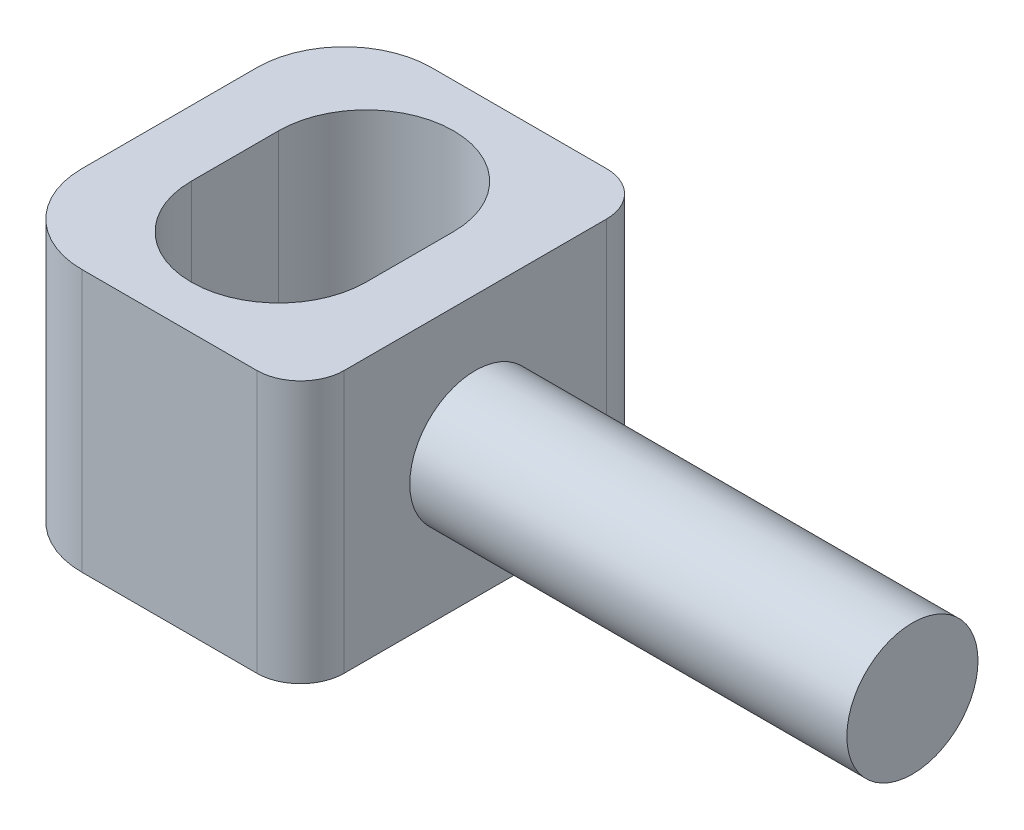
ISO-10303-21;
HEADER;
FILE_DESCRIPTION(('STEP AP214'),'2;1');
FILE_NAME('part.step','',(''),(''),'','','');
FILE_SCHEMA(('AUTOMOTIVE_DESIGN { 1 0 10303 214 1 1 1 1 }'));
ENDSEC;
DATA;
#1=APPLICATION_CONTEXT('core data for automotive mechanical design processes');
#2=APPLICATION_PROTOCOL_DEFINITION('international standard','automotive_design',2000,#1);
#3=PRODUCT_CONTEXT('',#1,'mechanical');
#4=PRODUCT('Part','Part','',(#3));
#5=PRODUCT_RELATED_PRODUCT_CATEGORY('part','',(#4));
#6=PRODUCT_DEFINITION_FORMATION('','',#4);
#7=PRODUCT_DEFINITION_CONTEXT('part definition',#1,'design');
#8=PRODUCT_DEFINITION('design','',#6,#7);
#9=PRODUCT_DEFINITION_SHAPE('','',#8);
#10=(LENGTH_UNIT() NAMED_UNIT(*) SI_UNIT(.MILLI.,.METRE.));
#11=(NAMED_UNIT(*) PLANE_ANGLE_UNIT() SI_UNIT($,.RADIAN.));
#12=(NAMED_UNIT(*) SI_UNIT($,.STERADIAN.) SOLID_ANGLE_UNIT());
#13=UNCERTAINTY_MEASURE_WITH_UNIT(LENGTH_MEASURE(1.E-05),#10,'distance_accuracy_value','');
#14=(GEOMETRIC_REPRESENTATION_CONTEXT(3) GLOBAL_UNCERTAINTY_ASSIGNED_CONTEXT((#13)) GLOBAL_UNIT_ASSIGNED_CONTEXT((#10,
#11,#12)) REPRESENTATION_CONTEXT('',''));
#15=CARTESIAN_POINT('',(0.,0.,0.));
#16=DIRECTION('',(0.,0.,1.));
#17=DIRECTION('',(1.,0.,0.));
#18=AXIS2_PLACEMENT_3D('',#15,#16,#17);
#19=CARTESIAN_POINT('',(-10.,30.,-10.));
#20=DIRECTION('',(0.,-1.,0.));
#21=DIRECTION('',(0.,0.,-1.));
#22=AXIS2_PLACEMENT_3D('',#19,#20,#21);
#23=PLANE('',#22);
#24=CARTESIAN_POINT('',(-10.,30.,-10.));
#25=DIRECTION('',(0.,1.,0.));
#26=DIRECTION('',(0.,0.,-1.));
#27=AXIS2_PLACEMENT_3D('',#24,#25,#26);
#28=CIRCLE('',#27,10.);
#29=CARTESIAN_POINT('',(-10.,30.,-20.));
#30=VERTEX_POINT('',#29);
#31=CARTESIAN_POINT('',(-20.,30.,-10.));
#32=VERTEX_POINT('',#31);
#33=EDGE_CURVE('E197',#30,#32,#28,.T.);
#34=ORIENTED_EDGE('',*,*,#33,.T.);
#35=DIRECTION('',(0.,0.,1.));
#36=VECTOR('',#35,1.);
#37=CARTESIAN_POINT('',(-20.,30.,10.));
#38=LINE('',#37,#36);
#39=CARTESIAN_POINT('',(-20.,30.,10.));
#40=VERTEX_POINT('',#39);
#41=EDGE_CURVE('E201',#32,#40,#38,.T.);
#42=ORIENTED_EDGE('',*,*,#41,.T.);
#43=CARTESIAN_POINT('',(-10.,30.,10.));
#44=DIRECTION('',(0.,1.,0.));
#45=DIRECTION('',(0.,0.,-1.));
#46=AXIS2_PLACEMENT_3D('',#43,#44,#45);
#47=CIRCLE('',#46,10.);
#48=CARTESIAN_POINT('',(-10.,30.,20.));
#49=VERTEX_POINT('',#48);
#50=EDGE_CURVE('E205',#40,#49,#47,.T.);
#51=ORIENTED_EDGE('',*,*,#50,.T.);
#52=DIRECTION('',(1.,0.,0.));
#53=VECTOR('',#52,1.);
#54=CARTESIAN_POINT('',(-10.,30.,20.));
#55=LINE('',#54,#53);
#56=CARTESIAN_POINT('',(10.,30.,20.));
#57=VERTEX_POINT('',#56);
#58=EDGE_CURVE('E208',#49,#57,#55,.T.);
#59=ORIENTED_EDGE('',*,*,#58,.T.);
#60=CARTESIAN_POINT('',(10.,30.,15.));
#61=DIRECTION('',(0.,1.,0.));
#62=DIRECTION('',(0.,0.,1.));
#63=AXIS2_PLACEMENT_3D('',#60,#61,#62);
#64=CIRCLE('',#63,5.);
#65=CARTESIAN_POINT('',(15.,30.,15.));
#66=VERTEX_POINT('',#65);
#67=EDGE_CURVE('E211',#57,#66,#64,.T.);
#68=ORIENTED_EDGE('',*,*,#67,.T.);
#69=DIRECTION('',(0.,0.,-1.));
#70=VECTOR('',#69,1.);
#71=CARTESIAN_POINT('',(15.,30.,15.));
#72=LINE('',#71,#70);
#73=CARTESIAN_POINT('',(15.,30.,-15.));
#74=VERTEX_POINT('',#73);
#75=EDGE_CURVE('E214',#66,#74,#72,.T.);
#76=ORIENTED_EDGE('',*,*,#75,.T.);
#77=CARTESIAN_POINT('',(10.,30.,-15.));
#78=DIRECTION('',(0.,1.,0.));
#79=DIRECTION('',(0.,0.,-1.));
#80=AXIS2_PLACEMENT_3D('',#77,#78,#79);
#81=CIRCLE('',#80,5.);
#82=CARTESIAN_POINT('',(10.,30.,-20.));
#83=VERTEX_POINT('',#82);
#84=EDGE_CURVE('E217',#74,#83,#81,.T.);
#85=ORIENTED_EDGE('',*,*,#84,.T.);
#86=DIRECTION('',(-1.,0.,0.));
#87=VECTOR('',#86,1.);
#88=CARTESIAN_POINT('',(-10.,30.,-20.));
#89=LINE('',#88,#87);
#90=EDGE_CURVE('E220',#83,#30,#89,.T.);
#91=ORIENTED_EDGE('',*,*,#90,.T.);
#92=EDGE_LOOP('',(#34,#42,#51,#59,#68,#76,#85,#91));
#93=FACE_BOUND('',#92,.T.);
#94=CARTESIAN_POINT('',(-2.5,30.,5.));
#95=DIRECTION('',(0.,1.,0.));
#96=DIRECTION('',(0.,0.,1.));
#97=AXIS2_PLACEMENT_3D('',#94,#95,#96);
#98=CIRCLE('',#97,10.);
#99=CARTESIAN_POINT('',(-12.5,30.,5.));
#100=VERTEX_POINT('',#99);
#101=CARTESIAN_POINT('',(7.5,30.,5.));
#102=VERTEX_POINT('',#101);
#103=EDGE_CURVE('E147',#100,#102,#98,.T.);
#104=ORIENTED_EDGE('',*,*,#103,.F.);
#105=DIRECTION('',(0.,0.,1.));
#106=VECTOR('',#105,1.);
#107=CARTESIAN_POINT('',(-12.5,30.,-5.));
#108=LINE('',#107,#106);
#109=CARTESIAN_POINT('',(-12.5,30.,-5.));
#110=VERTEX_POINT('',#109);
#111=EDGE_CURVE('E173',#110,#100,#108,.T.);
#112=ORIENTED_EDGE('',*,*,#111,.F.);
#113=CARTESIAN_POINT('',(-2.5,30.,-5.));
#114=DIRECTION('',(0.,1.,0.));
#115=DIRECTION('',(0.,0.,-1.));
#116=AXIS2_PLACEMENT_3D('',#113,#114,#115);
#117=CIRCLE('',#116,10.);
#118=CARTESIAN_POINT('',(7.5,30.,-5.));
#119=VERTEX_POINT('',#118);
#120=EDGE_CURVE('E169',#119,#110,#117,.T.);
#121=ORIENTED_EDGE('',*,*,#120,.F.);
#122=DIRECTION('',(0.,0.,-1.));
#123=VECTOR('',#122,1.);
#124=CARTESIAN_POINT('',(7.5,30.,-5.));
#125=LINE('',#124,#123);
#126=EDGE_CURVE('E156',#102,#119,#125,.T.);
#127=ORIENTED_EDGE('',*,*,#126,.F.);
#128=EDGE_LOOP('',(#104,#112,#121,#127));
#129=FACE_BOUND('',#128,.T.);
#130=ADVANCED_FACE('F57',(#93,#129),#23,.F.);
#131=CARTESIAN_POINT('',(-10.,0.,-10.));
#132=DIRECTION('',(0.,-1.,0.));
#133=DIRECTION('',(0.,0.,-1.));
#134=AXIS2_PLACEMENT_3D('',#131,#132,#133);
#135=PLANE('',#134);
#136=CARTESIAN_POINT('',(-10.,0.,-10.));
#137=DIRECTION('',(0.,1.,0.));
#138=DIRECTION('',(0.,0.,-1.));
#139=AXIS2_PLACEMENT_3D('',#136,#137,#138);
#140=CIRCLE('',#139,10.);
#141=CARTESIAN_POINT('',(-10.,0.,-20.));
#142=VERTEX_POINT('',#141);
#143=CARTESIAN_POINT('',(-20.,0.,-10.));
#144=VERTEX_POINT('',#143);
#145=EDGE_CURVE('E165',#142,#144,#140,.T.);
#146=ORIENTED_EDGE('',*,*,#145,.F.);
#147=DIRECTION('',(-1.,0.,0.));
#148=VECTOR('',#147,1.);
#149=CARTESIAN_POINT('',(-10.,0.,-20.));
#150=LINE('',#149,#148);
#151=CARTESIAN_POINT('',(10.,0.,-20.));
#152=VERTEX_POINT('',#151);
#153=EDGE_CURVE('E202',#152,#142,#150,.T.);
#154=ORIENTED_EDGE('',*,*,#153,.F.);
#155=CARTESIAN_POINT('',(10.,0.,-15.));
#156=DIRECTION('',(0.,1.,0.));
#157=DIRECTION('',(0.,0.,-1.));
#158=AXIS2_PLACEMENT_3D('',#155,#156,#157);
#159=CIRCLE('',#158,5.);
#160=CARTESIAN_POINT('',(15.,0.,-15.));
#161=VERTEX_POINT('',#160);
#162=EDGE_CURVE('E242',#161,#152,#159,.T.);
#163=ORIENTED_EDGE('',*,*,#162,.F.);
#164=DIRECTION('',(0.,0.,-1.));
#165=VECTOR('',#164,1.);
#166=CARTESIAN_POINT('',(15.,0.,15.));
#167=LINE('',#166,#165);
#168=CARTESIAN_POINT('',(15.,0.,15.));
#169=VERTEX_POINT('',#168);
#170=EDGE_CURVE('E239',#169,#161,#167,.T.);
#171=ORIENTED_EDGE('',*,*,#170,.F.);
#172=CARTESIAN_POINT('',(10.,0.,15.));
#173=DIRECTION('',(0.,1.,0.));
#174=DIRECTION('',(0.,0.,1.));
#175=AXIS2_PLACEMENT_3D('',#172,#173,#174);
#176=CIRCLE('',#175,5.);
#177=CARTESIAN_POINT('',(10.,0.,20.));
#178=VERTEX_POINT('',#177);
#179=EDGE_CURVE('E236',#178,#169,#176,.T.);
#180=ORIENTED_EDGE('',*,*,#179,.F.);
#181=DIRECTION('',(1.,0.,0.));
#182=VECTOR('',#181,1.);
#183=CARTESIAN_POINT('',(-10.,0.,20.));
#184=LINE('',#183,#182);
#185=CARTESIAN_POINT('',(-10.,0.,20.));
#186=VERTEX_POINT('',#185);
#187=EDGE_CURVE('E233',#186,#178,#184,.T.);
#188=ORIENTED_EDGE('',*,*,#187,.F.);
#189=CARTESIAN_POINT('',(-10.,0.,10.));
#190=DIRECTION('',(0.,1.,0.));
#191=DIRECTION('',(0.,0.,-1.));
#192=AXIS2_PLACEMENT_3D('',#189,#190,#191);
#193=CIRCLE('',#192,10.);
#194=CARTESIAN_POINT('',(-20.,0.,10.));
#195=VERTEX_POINT('',#194);
#196=EDGE_CURVE('E230',#195,#186,#193,.T.);
#197=ORIENTED_EDGE('',*,*,#196,.F.);
#198=DIRECTION('',(0.,0.,1.));
#199=VECTOR('',#198,1.);
#200=CARTESIAN_POINT('',(-20.,0.,10.));
#201=LINE('',#200,#199);
#202=EDGE_CURVE('E227',#144,#195,#201,.T.);
#203=ORIENTED_EDGE('',*,*,#202,.F.);
#204=EDGE_LOOP('',(#146,#154,#163,#171,#180,#188,#197,#203));
#205=FACE_BOUND('',#204,.T.);
#206=DIRECTION('',(0.,0.,1.));
#207=VECTOR('',#206,1.);
#208=CARTESIAN_POINT('',(-12.5,0.,-5.));
#209=LINE('',#208,#207);
#210=CARTESIAN_POINT('',(-12.5,0.,-5.));
#211=VERTEX_POINT('',#210);
#212=CARTESIAN_POINT('',(-12.5,0.,5.));
#213=VERTEX_POINT('',#212);
#214=EDGE_CURVE('E157',#211,#213,#209,.T.);
#215=ORIENTED_EDGE('',*,*,#214,.T.);
#216=CARTESIAN_POINT('',(-2.5,0.,5.));
#217=DIRECTION('',(0.,1.,0.));
#218=DIRECTION('',(0.,0.,1.));
#219=AXIS2_PLACEMENT_3D('',#216,#217,#218);
#220=CIRCLE('',#219,10.);
#221=CARTESIAN_POINT('',(7.5,0.,5.));
#222=VERTEX_POINT('',#221);
#223=EDGE_CURVE('E81',#213,#222,#220,.T.);
#224=ORIENTED_EDGE('',*,*,#223,.T.);
#225=DIRECTION('',(0.,0.,-1.));
#226=VECTOR('',#225,1.);
#227=CARTESIAN_POINT('',(7.5,0.,-5.));
#228=LINE('',#227,#226);
#229=CARTESIAN_POINT('',(7.5,0.,-5.));
#230=VERTEX_POINT('',#229);
#231=EDGE_CURVE('E163',#222,#230,#228,.T.);
#232=ORIENTED_EDGE('',*,*,#231,.T.);
#233=CARTESIAN_POINT('',(-2.5,0.,-5.));
#234=DIRECTION('',(0.,1.,0.));
#235=DIRECTION('',(0.,0.,-1.));
#236=AXIS2_PLACEMENT_3D('',#233,#234,#235);
#237=CIRCLE('',#236,10.);
#238=EDGE_CURVE('E184',#230,#211,#237,.T.);
#239=ORIENTED_EDGE('',*,*,#238,.T.);
#240=EDGE_LOOP('',(#215,#224,#232,#239));
#241=FACE_BOUND('',#240,.T.);
#242=ADVANCED_FACE('F285',(#205,#241),#135,.T.);
#243=CARTESIAN_POINT('',(-10.,30.,-10.));
#244=DIRECTION('',(0.,-1.,0.));
#245=DIRECTION('',(0.,0.,-1.));
#246=AXIS2_PLACEMENT_3D('',#243,#244,#245);
#247=CYLINDRICAL_SURFACE('',#246,10.);
#248=ORIENTED_EDGE('',*,*,#145,.T.);
#249=DIRECTION('',(0.,-1.,0.));
#250=VECTOR('',#249,1.);
#251=CARTESIAN_POINT('',(-20.,30.,-10.));
#252=LINE('',#251,#250);
#253=EDGE_CURVE('E66',#32,#144,#252,.T.);
#254=ORIENTED_EDGE('',*,*,#253,.F.);
#255=ORIENTED_EDGE('',*,*,#33,.F.);
#256=DIRECTION('',(0.,-1.,0.));
#257=VECTOR('',#256,1.);
#258=CARTESIAN_POINT('',(-10.,30.,-20.));
#259=LINE('',#258,#257);
#260=EDGE_CURVE('E223',#30,#142,#259,.T.);
#261=ORIENTED_EDGE('',*,*,#260,.T.);
#262=EDGE_LOOP('',(#248,#254,#255,#261));
#263=FACE_BOUND('',#262,.T.);
#264=ADVANCED_FACE('F59',(#263),#247,.T.);
#265=CARTESIAN_POINT('',(-20.,30.,10.));
#266=DIRECTION('',(1.,0.,0.));
#267=DIRECTION('',(0.,0.,-1.));
#268=AXIS2_PLACEMENT_3D('',#265,#266,#267);
#269=PLANE('',#268);
#270=ORIENTED_EDGE('',*,*,#202,.T.);
#271=DIRECTION('',(0.,-1.,0.));
#272=VECTOR('',#271,1.);
#273=CARTESIAN_POINT('',(-20.,30.,10.));
#274=LINE('',#273,#272);
#275=EDGE_CURVE('E270',#40,#195,#274,.T.);
#276=ORIENTED_EDGE('',*,*,#275,.F.);
#277=ORIENTED_EDGE('',*,*,#41,.F.);
#278=ORIENTED_EDGE('',*,*,#253,.T.);
#279=EDGE_LOOP('',(#270,#276,#277,#278));
#280=FACE_BOUND('',#279,.T.);
#281=ADVANCED_FACE('F277',(#280),#269,.F.);
#282=CARTESIAN_POINT('',(-10.,30.,10.));
#283=DIRECTION('',(0.,-1.,0.));
#284=DIRECTION('',(0.,0.,-1.));
#285=AXIS2_PLACEMENT_3D('',#282,#283,#284);
#286=CYLINDRICAL_SURFACE('',#285,10.);
#287=ORIENTED_EDGE('',*,*,#196,.T.);
#288=DIRECTION('',(0.,-1.,0.));
#289=VECTOR('',#288,1.);
#290=CARTESIAN_POINT('',(-10.,30.,20.));
#291=LINE('',#290,#289);
#292=EDGE_CURVE('E266',#49,#186,#291,.T.);
#293=ORIENTED_EDGE('',*,*,#292,.F.);
#294=ORIENTED_EDGE('',*,*,#50,.F.);
#295=ORIENTED_EDGE('',*,*,#275,.T.);
#296=EDGE_LOOP('',(#287,#293,#294,#295));
#297=FACE_BOUND('',#296,.T.);
#298=ADVANCED_FACE('F293',(#297),#286,.T.);
#299=CARTESIAN_POINT('',(-10.,30.,20.));
#300=DIRECTION('',(0.,0.,-1.));
#301=DIRECTION('',(-1.,0.,0.));
#302=AXIS2_PLACEMENT_3D('',#299,#300,#301);
#303=PLANE('',#302);
#304=ORIENTED_EDGE('',*,*,#187,.T.);
#305=DIRECTION('',(0.,-1.,0.));
#306=VECTOR('',#305,1.);
#307=CARTESIAN_POINT('',(10.,30.,20.));
#308=LINE('',#307,#306);
#309=EDGE_CURVE('E262',#57,#178,#308,.T.);
#310=ORIENTED_EDGE('',*,*,#309,.F.);
#311=ORIENTED_EDGE('',*,*,#58,.F.);
#312=ORIENTED_EDGE('',*,*,#292,.T.);
#313=EDGE_LOOP('',(#304,#310,#311,#312));
#314=FACE_BOUND('',#313,.T.);
#315=ADVANCED_FACE('F297',(#314),#303,.F.);
#316=CARTESIAN_POINT('',(10.,30.,15.));
#317=DIRECTION('',(0.,-1.,0.));
#318=DIRECTION('',(0.,0.,-1.));
#319=AXIS2_PLACEMENT_3D('',#316,#317,#318);
#320=CYLINDRICAL_SURFACE('',#319,5.);
#321=ORIENTED_EDGE('',*,*,#179,.T.);
#322=DIRECTION('',(0.,-1.,0.));
#323=VECTOR('',#322,1.);
#324=CARTESIAN_POINT('',(15.,30.,15.));
#325=LINE('',#324,#323);
#326=EDGE_CURVE('E258',#66,#169,#325,.T.);
#327=ORIENTED_EDGE('',*,*,#326,.F.);
#328=ORIENTED_EDGE('',*,*,#67,.F.);
#329=ORIENTED_EDGE('',*,*,#309,.T.);
#330=EDGE_LOOP('',(#321,#327,#328,#329));
#331=FACE_BOUND('',#330,.T.);
#332=ADVANCED_FACE('F315',(#331),#320,.T.);
#333=CARTESIAN_POINT('',(15.,30.,15.));
#334=DIRECTION('',(-1.,0.,0.));
#335=DIRECTION('',(0.,0.,1.));
#336=AXIS2_PLACEMENT_3D('',#333,#334,#335);
#337=PLANE('',#336);
#338=CARTESIAN_POINT('',(15.,15.,0.));
#339=DIRECTION('',(-1.,0.,0.));
#340=DIRECTION('',(0.,0.,1.));
#341=AXIS2_PLACEMENT_3D('',#338,#339,#340);
#342=CIRCLE('',#341,7.5);
#343=CARTESIAN_POINT('',(15.,15.,7.5));
#344=VERTEX_POINT('',#343);
#345=EDGE_CURVE('E13',#344,#344,#342,.F.);
#346=ORIENTED_EDGE('',*,*,#345,.F.);
#347=EDGE_LOOP('',(#346));
#348=FACE_BOUND('',#347,.T.);
#349=ORIENTED_EDGE('',*,*,#170,.T.);
#350=DIRECTION('',(0.,-1.,0.));
#351=VECTOR('',#350,1.);
#352=CARTESIAN_POINT('',(15.,30.,-15.));
#353=LINE('',#352,#351);
#354=EDGE_CURVE('E254',#74,#161,#353,.T.);
#355=ORIENTED_EDGE('',*,*,#354,.F.);
#356=ORIENTED_EDGE('',*,*,#75,.F.);
#357=ORIENTED_EDGE('',*,*,#326,.T.);
#358=EDGE_LOOP('',(#349,#355,#356,#357));
#359=FACE_BOUND('',#358,.T.);
#360=ADVANCED_FACE('F312',(#348,#359),#337,.F.);
#361=CARTESIAN_POINT('',(10.,30.,-15.));
#362=DIRECTION('',(0.,-1.,0.));
#363=DIRECTION('',(0.,0.,-1.));
#364=AXIS2_PLACEMENT_3D('',#361,#362,#363);
#365=CYLINDRICAL_SURFACE('',#364,5.);
#366=ORIENTED_EDGE('',*,*,#162,.T.);
#367=DIRECTION('',(0.,-1.,0.));
#368=VECTOR('',#367,1.);
#369=CARTESIAN_POINT('',(10.,30.,-20.));
#370=LINE('',#369,#368);
#371=EDGE_CURVE('E250',#83,#152,#370,.T.);
#372=ORIENTED_EDGE('',*,*,#371,.F.);
#373=ORIENTED_EDGE('',*,*,#84,.F.);
#374=ORIENTED_EDGE('',*,*,#354,.T.);
#375=EDGE_LOOP('',(#366,#372,#373,#374));
#376=FACE_BOUND('',#375,.T.);
#377=ADVANCED_FACE('F308',(#376),#365,.T.);
#378=CARTESIAN_POINT('',(-10.,30.,-20.));
#379=DIRECTION('',(0.,0.,1.));
#380=DIRECTION('',(1.,0.,0.));
#381=AXIS2_PLACEMENT_3D('',#378,#379,#380);
#382=PLANE('',#381);
#383=ORIENTED_EDGE('',*,*,#153,.T.);
#384=ORIENTED_EDGE('',*,*,#260,.F.);
#385=ORIENTED_EDGE('',*,*,#90,.F.);
#386=ORIENTED_EDGE('',*,*,#371,.T.);
#387=EDGE_LOOP('',(#383,#384,#385,#386));
#388=FACE_BOUND('',#387,.T.);
#389=ADVANCED_FACE('F306',(#388),#382,.F.);
#390=CARTESIAN_POINT('',(-2.5,30.,5.));
#391=DIRECTION('',(0.,-1.,0.));
#392=DIRECTION('',(0.,0.,-1.));
#393=AXIS2_PLACEMENT_3D('',#390,#391,#392);
#394=CYLINDRICAL_SURFACE('',#393,10.);
#395=ORIENTED_EDGE('',*,*,#223,.F.);
#396=DIRECTION('',(0.,-1.,0.));
#397=VECTOR('',#396,1.);
#398=CARTESIAN_POINT('',(-12.5,30.,5.));
#399=LINE('',#398,#397);
#400=EDGE_CURVE('E151',#100,#213,#399,.T.);
#401=ORIENTED_EDGE('',*,*,#400,.F.);
#402=ORIENTED_EDGE('',*,*,#103,.T.);
#403=DIRECTION('',(0.,-1.,0.));
#404=VECTOR('',#403,1.);
#405=CARTESIAN_POINT('',(7.5,30.,5.));
#406=LINE('',#405,#404);
#407=EDGE_CURVE('E150',#102,#222,#406,.T.);
#408=ORIENTED_EDGE('',*,*,#407,.T.);
#409=EDGE_LOOP('',(#395,#401,#402,#408));
#410=FACE_BOUND('',#409,.T.);
#411=ADVANCED_FACE('F149',(#410),#394,.F.);
#412=CARTESIAN_POINT('',(7.5,30.,-5.));
#413=DIRECTION('',(-1.,0.,0.));
#414=DIRECTION('',(0.,0.,1.));
#415=AXIS2_PLACEMENT_3D('',#412,#413,#414);
#416=PLANE('',#415);
#417=ORIENTED_EDGE('',*,*,#231,.F.);
#418=ORIENTED_EDGE('',*,*,#407,.F.);
#419=ORIENTED_EDGE('',*,*,#126,.T.);
#420=DIRECTION('',(0.,-1.,0.));
#421=VECTOR('',#420,1.);
#422=CARTESIAN_POINT('',(7.5,30.,-5.));
#423=LINE('',#422,#421);
#424=EDGE_CURVE('E166',#119,#230,#423,.T.);
#425=ORIENTED_EDGE('',*,*,#424,.T.);
#426=EDGE_LOOP('',(#417,#418,#419,#425));
#427=FACE_BOUND('',#426,.T.);
#428=ADVANCED_FACE('F160',(#427),#416,.T.);
#429=CARTESIAN_POINT('',(-2.5,30.,-5.));
#430=DIRECTION('',(0.,-1.,0.));
#431=DIRECTION('',(0.,0.,-1.));
#432=AXIS2_PLACEMENT_3D('',#429,#430,#431);
#433=CYLINDRICAL_SURFACE('',#432,10.);
#434=ORIENTED_EDGE('',*,*,#238,.F.);
#435=ORIENTED_EDGE('',*,*,#424,.F.);
#436=ORIENTED_EDGE('',*,*,#120,.T.);
#437=DIRECTION('',(0.,-1.,0.));
#438=VECTOR('',#437,1.);
#439=CARTESIAN_POINT('',(-12.5,30.,-5.));
#440=LINE('',#439,#438);
#441=EDGE_CURVE('E73',#110,#211,#440,.T.);
#442=ORIENTED_EDGE('',*,*,#441,.T.);
#443=EDGE_LOOP('',(#434,#435,#436,#442));
#444=FACE_BOUND('',#443,.T.);
#445=ADVANCED_FACE('F358',(#444),#433,.F.);
#446=CARTESIAN_POINT('',(-12.5,30.,-5.));
#447=DIRECTION('',(1.,0.,0.));
#448=DIRECTION('',(0.,0.,-1.));
#449=AXIS2_PLACEMENT_3D('',#446,#447,#448);
#450=PLANE('',#449);
#451=ORIENTED_EDGE('',*,*,#214,.F.);
#452=ORIENTED_EDGE('',*,*,#441,.F.);
#453=ORIENTED_EDGE('',*,*,#111,.T.);
#454=ORIENTED_EDGE('',*,*,#400,.T.);
#455=EDGE_LOOP('',(#451,#452,#453,#454));
#456=FACE_BOUND('',#455,.T.);
#457=ADVANCED_FACE('F365',(#456),#450,.T.);
#458=CARTESIAN_POINT('',(65.,15.,0.));
#459=DIRECTION('',(-1.,0.,0.));
#460=DIRECTION('',(0.,0.,1.));
#461=AXIS2_PLACEMENT_3D('',#458,#459,#460);
#462=CYLINDRICAL_SURFACE('',#461,7.5);
#463=CARTESIAN_POINT('',(65.,15.,0.));
#464=DIRECTION('',(1.,0.,0.));
#465=DIRECTION('',(0.,0.,-1.));
#466=AXIS2_PLACEMENT_3D('',#463,#464,#465);
#467=CIRCLE('',#466,7.5);
#468=CARTESIAN_POINT('',(65.,15.,-7.5));
#469=VERTEX_POINT('',#468);
#470=EDGE_CURVE('E181',#469,#469,#467,.T.);
#471=ORIENTED_EDGE('',*,*,#470,.F.);
#472=EDGE_LOOP('',(#471));
#473=FACE_BOUND('',#472,.T.);
#474=ORIENTED_EDGE('',*,*,#345,.T.);
#475=EDGE_LOOP('',(#474));
#476=FACE_BOUND('',#475,.T.);
#477=ADVANCED_FACE('F373',(#473,#476),#462,.T.);
#478=CARTESIAN_POINT('',(65.,15.,0.));
#479=DIRECTION('',(1.,0.,0.));
#480=DIRECTION('',(0.,0.,-1.));
#481=AXIS2_PLACEMENT_3D('',#478,#479,#480);
#482=PLANE('',#481);
#483=ORIENTED_EDGE('',*,*,#470,.T.);
#484=EDGE_LOOP('',(#483));
#485=FACE_BOUND('',#484,.T.);
#486=ADVANCED_FACE('F386',(#485),#482,.T.);
#487=CLOSED_SHELL('',(#130,#242,#264,#281,#298,#315,#332,#360,#377,#389,#411,#428,#445,#457,
#477,#486));
#488=MANIFOLD_SOLID_BREP('B2',#487);
#489=ADVANCED_BREP_SHAPE_REPRESENTATION('',(#18,#488),#14);
#490=SHAPE_DEFINITION_REPRESENTATION(#9,#489);
ENDSEC;
END-ISO-10303-21;
